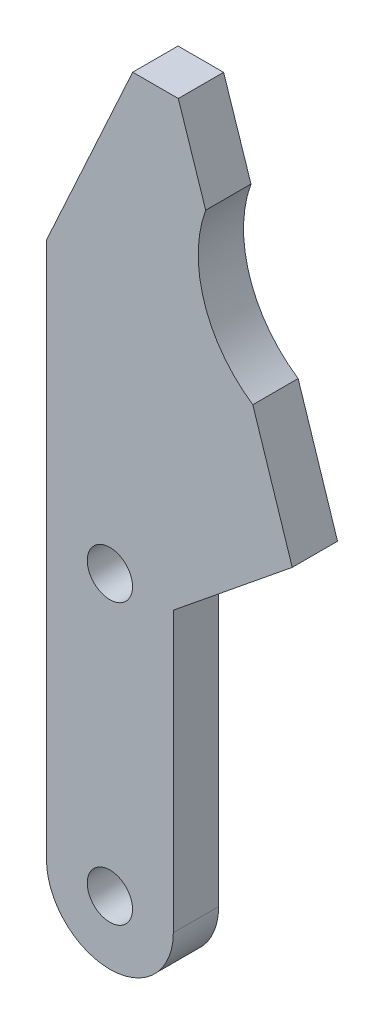
ISO-10303-21;
HEADER;
FILE_DESCRIPTION(('STEP AP214'),'2;1');
FILE_NAME('part.step','',(''),(''),'','','');
FILE_SCHEMA(('AUTOMOTIVE_DESIGN { 1 0 10303 214 1 1 1 1 }'));
ENDSEC;
DATA;
#1=APPLICATION_CONTEXT('core data for automotive mechanical design processes');
#2=APPLICATION_PROTOCOL_DEFINITION('international standard','automotive_design',2000,#1);
#3=PRODUCT_CONTEXT('',#1,'mechanical');
#4=PRODUCT('Part','Part','',(#3));
#5=PRODUCT_RELATED_PRODUCT_CATEGORY('part','',(#4));
#6=PRODUCT_DEFINITION_FORMATION('','',#4);
#7=PRODUCT_DEFINITION_CONTEXT('part definition',#1,'design');
#8=PRODUCT_DEFINITION('design','',#6,#7);
#9=PRODUCT_DEFINITION_SHAPE('','',#8);
#10=(LENGTH_UNIT() NAMED_UNIT(*) SI_UNIT(.MILLI.,.METRE.));
#11=(NAMED_UNIT(*) PLANE_ANGLE_UNIT() SI_UNIT($,.RADIAN.));
#12=(NAMED_UNIT(*) SI_UNIT($,.STERADIAN.) SOLID_ANGLE_UNIT());
#13=UNCERTAINTY_MEASURE_WITH_UNIT(LENGTH_MEASURE(1.E-05),#10,'distance_accuracy_value','');
#14=(GEOMETRIC_REPRESENTATION_CONTEXT(3) GLOBAL_UNCERTAINTY_ASSIGNED_CONTEXT((#13)) GLOBAL_UNIT_ASSIGNED_CONTEXT((#10,
#11,#12)) REPRESENTATION_CONTEXT('',''));
#15=CARTESIAN_POINT('',(0.,0.,0.));
#16=DIRECTION('',(0.,0.,1.));
#17=DIRECTION('',(1.,0.,0.));
#18=AXIS2_PLACEMENT_3D('',#15,#16,#17);
#19=CARTESIAN_POINT('',(4.16338722026961,4.86819386238371,1.27));
#20=DIRECTION('',(0.,0.,1.));
#21=DIRECTION('',(1.,0.,0.));
#22=AXIS2_PLACEMENT_3D('',#19,#20,#21);
#23=PLANE('',#22);
#24=CARTESIAN_POINT('',(-1.778,-11.938,1.27));
#25=DIRECTION('',(0.,0.,1.));
#26=DIRECTION('',(1.,0.,0.));
#27=AXIS2_PLACEMENT_3D('',#24,#25,#26);
#28=CIRCLE('',#27,0.635);
#29=CARTESIAN_POINT('',(-1.143,-11.938,1.27));
#30=VERTEX_POINT('',#29);
#31=EDGE_CURVE('E146',#30,#30,#28,.T.);
#32=ORIENTED_EDGE('',*,*,#31,.F.);
#33=EDGE_LOOP('',(#32));
#34=FACE_BOUND('',#33,.T.);
#35=CARTESIAN_POINT('',(4.16338722026961,4.86819386238371,1.27));
#36=DIRECTION('',(0.,0.,-1.));
#37=DIRECTION('',(1.,0.,0.));
#38=AXIS2_PLACEMENT_3D('',#35,#36,#37);
#39=CIRCLE('',#38,3.46596264179077);
#40=CARTESIAN_POINT('',(2.22771200534664,1.99311847265534,1.27));
#41=VERTEX_POINT('',#40);
#42=CARTESIAN_POINT('',(0.906732126933909,6.05440406185947,1.27));
#43=VERTEX_POINT('',#42);
#44=EDGE_CURVE('E159',#41,#43,#39,.T.);
#45=ORIENTED_EDGE('',*,*,#44,.T.);
#46=DIRECTION('',(-0.313175536784699,0.949695258048399,0.));
#47=VECTOR('',#46,1.);
#48=CARTESIAN_POINT('',(0.906732126933909,6.05440406185947,1.27));
#49=LINE('',#48,#47);
#50=CARTESIAN_POINT('',(0.139174216996555,8.382,1.27));
#51=VERTEX_POINT('',#50);
#52=EDGE_CURVE('E102',#43,#51,#49,.T.);
#53=ORIENTED_EDGE('',*,*,#52,.T.);
#54=DIRECTION('',(-1.,0.,0.));
#55=VECTOR('',#54,1.);
#56=CARTESIAN_POINT('',(0.139174216996555,8.382,1.27));
#57=LINE('',#56,#55);
#58=CARTESIAN_POINT('',(-1.13865738551377,8.382,1.27));
#59=VERTEX_POINT('',#58);
#60=EDGE_CURVE('E177',#51,#59,#57,.T.);
#61=ORIENTED_EDGE('',*,*,#60,.T.);
#62=DIRECTION('',(-0.416099978071877,-0.909318870500653,0.));
#63=VECTOR('',#62,1.);
#64=CARTESIAN_POINT('',(-3.556,3.09929062326937,1.27));
#65=LINE('',#64,#63);
#66=CARTESIAN_POINT('',(-3.556,3.09929062326937,1.27));
#67=VERTEX_POINT('',#66);
#68=EDGE_CURVE('E194',#59,#67,#65,.T.);
#69=ORIENTED_EDGE('',*,*,#68,.T.);
#70=DIRECTION('',(0.,-1.,0.));
#71=VECTOR('',#70,1.);
#72=CARTESIAN_POINT('',(-3.556,-11.938,1.27));
#73=LINE('',#72,#71);
#74=CARTESIAN_POINT('',(-3.556,-11.938,1.27));
#75=VERTEX_POINT('',#74);
#76=EDGE_CURVE('E193',#67,#75,#73,.T.);
#77=ORIENTED_EDGE('',*,*,#76,.T.);
#78=CARTESIAN_POINT('',(-1.778,-11.938,1.27));
#79=DIRECTION('',(0.,0.,1.));
#80=DIRECTION('',(1.,0.,0.));
#81=AXIS2_PLACEMENT_3D('',#78,#79,#80);
#82=CIRCLE('',#81,1.778);
#83=CARTESIAN_POINT('',(0.,-11.938,1.27));
#84=VERTEX_POINT('',#83);
#85=EDGE_CURVE('E124',#75,#84,#82,.T.);
#86=ORIENTED_EDGE('',*,*,#85,.T.);
#87=DIRECTION('',(0.,1.,0.));
#88=VECTOR('',#87,1.);
#89=CARTESIAN_POINT('',(0.,-11.938,1.27));
#90=LINE('',#89,#88);
#91=CARTESIAN_POINT('',(0.,-4.10790092400963,1.27));
#92=VERTEX_POINT('',#91);
#93=EDGE_CURVE('E118',#84,#92,#90,.T.);
#94=ORIENTED_EDGE('',*,*,#93,.T.);
#95=DIRECTION('',(0.776539289188919,0.630068831435082,0.));
#96=VECTOR('',#95,1.);
#97=CARTESIAN_POINT('',(0.,-4.10790092400963,1.27));
#98=LINE('',#97,#96);
#99=CARTESIAN_POINT('',(3.3326233424179,-1.40387535285829,1.27));
#100=VERTEX_POINT('',#99);
#101=EDGE_CURVE('E122',#92,#100,#98,.T.);
#102=ORIENTED_EDGE('',*,*,#101,.T.);
#103=DIRECTION('',(-0.309310990458131,0.950960940933859,0.));
#104=VECTOR('',#103,1.);
#105=CARTESIAN_POINT('',(3.3326233424179,-1.40387535285829,1.27));
#106=LINE('',#105,#104);
#107=EDGE_CURVE('E56',#100,#41,#106,.T.);
#108=ORIENTED_EDGE('',*,*,#107,.T.);
#109=EDGE_LOOP('',(#45,#53,#61,#69,#77,#86,#94,#102,#108));
#110=FACE_BOUND('',#109,.T.);
#111=CARTESIAN_POINT('',(-1.778,-4.10790092400963,1.27));
#112=DIRECTION('',(0.,0.,1.));
#113=DIRECTION('',(1.,0.,0.));
#114=AXIS2_PLACEMENT_3D('',#111,#112,#113);
#115=CIRCLE('',#114,0.635000000000001);
#116=CARTESIAN_POINT('',(-1.143,-4.10790092400963,1.27));
#117=VERTEX_POINT('',#116);
#118=EDGE_CURVE('E204',#117,#117,#115,.T.);
#119=ORIENTED_EDGE('',*,*,#118,.F.);
#120=EDGE_LOOP('',(#119));
#121=FACE_BOUND('',#120,.T.);
#122=ADVANCED_FACE('F39',(#34,#110,#121),#23,.T.);
#123=CARTESIAN_POINT('',(4.16338722026961,4.86819386238371,0.));
#124=DIRECTION('',(0.,0.,1.));
#125=DIRECTION('',(1.,0.,0.));
#126=AXIS2_PLACEMENT_3D('',#123,#124,#125);
#127=PLANE('',#126);
#128=CARTESIAN_POINT('',(4.16338722026961,4.86819386238371,0.));
#129=DIRECTION('',(0.,0.,-1.));
#130=DIRECTION('',(1.,0.,0.));
#131=AXIS2_PLACEMENT_3D('',#128,#129,#130);
#132=CIRCLE('',#131,3.46596264179077);
#133=CARTESIAN_POINT('',(2.22771200534664,1.99311847265534,0.));
#134=VERTEX_POINT('',#133);
#135=CARTESIAN_POINT('',(0.906732126933909,6.05440406185947,0.));
#136=VERTEX_POINT('',#135);
#137=EDGE_CURVE('E142',#134,#136,#132,.T.);
#138=ORIENTED_EDGE('',*,*,#137,.F.);
#139=DIRECTION('',(-0.309310990458131,0.950960940933859,0.));
#140=VECTOR('',#139,1.);
#141=CARTESIAN_POINT('',(3.3326233424179,-1.40387535285829,0.));
#142=LINE('',#141,#140);
#143=CARTESIAN_POINT('',(3.3326233424179,-1.40387535285829,0.));
#144=VERTEX_POINT('',#143);
#145=EDGE_CURVE('E94',#144,#134,#142,.T.);
#146=ORIENTED_EDGE('',*,*,#145,.F.);
#147=DIRECTION('',(0.776539289188919,0.630068831435082,0.));
#148=VECTOR('',#147,1.);
#149=CARTESIAN_POINT('',(0.,-4.10790092400963,0.));
#150=LINE('',#149,#148);
#151=CARTESIAN_POINT('',(0.,-4.10790092400963,0.));
#152=VERTEX_POINT('',#151);
#153=EDGE_CURVE('E88',#152,#144,#150,.T.);
#154=ORIENTED_EDGE('',*,*,#153,.F.);
#155=DIRECTION('',(0.,1.,0.));
#156=VECTOR('',#155,1.);
#157=CARTESIAN_POINT('',(0.,-11.938,0.));
#158=LINE('',#157,#156);
#159=CARTESIAN_POINT('',(0.,-11.938,0.));
#160=VERTEX_POINT('',#159);
#161=EDGE_CURVE('E132',#160,#152,#158,.T.);
#162=ORIENTED_EDGE('',*,*,#161,.F.);
#163=CARTESIAN_POINT('',(-1.778,-11.938,0.));
#164=DIRECTION('',(0.,0.,1.));
#165=DIRECTION('',(1.,0.,0.));
#166=AXIS2_PLACEMENT_3D('',#163,#164,#165);
#167=CIRCLE('',#166,1.778);
#168=CARTESIAN_POINT('',(-3.556,-11.938,0.));
#169=VERTEX_POINT('',#168);
#170=EDGE_CURVE('E154',#169,#160,#167,.T.);
#171=ORIENTED_EDGE('',*,*,#170,.F.);
#172=DIRECTION('',(0.,-1.,0.));
#173=VECTOR('',#172,1.);
#174=CARTESIAN_POINT('',(-3.556,-11.938,0.));
#175=LINE('',#174,#173);
#176=CARTESIAN_POINT('',(-3.556,3.09929062326937,0.));
#177=VERTEX_POINT('',#176);
#178=EDGE_CURVE('E152',#177,#169,#175,.T.);
#179=ORIENTED_EDGE('',*,*,#178,.F.);
#180=DIRECTION('',(-0.416099978071877,-0.909318870500653,0.));
#181=VECTOR('',#180,1.);
#182=CARTESIAN_POINT('',(-3.556,3.09929062326937,0.));
#183=LINE('',#182,#181);
#184=CARTESIAN_POINT('',(-1.13865738551377,8.382,0.));
#185=VERTEX_POINT('',#184);
#186=EDGE_CURVE('E150',#185,#177,#183,.T.);
#187=ORIENTED_EDGE('',*,*,#186,.F.);
#188=DIRECTION('',(-1.,0.,0.));
#189=VECTOR('',#188,1.);
#190=CARTESIAN_POINT('',(0.139174216996555,8.382,0.));
#191=LINE('',#190,#189);
#192=CARTESIAN_POINT('',(0.139174216996555,8.382,0.));
#193=VERTEX_POINT('',#192);
#194=EDGE_CURVE('E148',#193,#185,#191,.T.);
#195=ORIENTED_EDGE('',*,*,#194,.F.);
#196=DIRECTION('',(-0.313175536784699,0.949695258048399,0.));
#197=VECTOR('',#196,1.);
#198=CARTESIAN_POINT('',(0.906732126933909,6.05440406185947,0.));
#199=LINE('',#198,#197);
#200=EDGE_CURVE('E145',#136,#193,#199,.T.);
#201=ORIENTED_EDGE('',*,*,#200,.F.);
#202=EDGE_LOOP('',(#138,#146,#154,#162,#171,#179,#187,#195,#201));
#203=FACE_BOUND('',#202,.T.);
#204=CARTESIAN_POINT('',(-1.778,-11.938,0.));
#205=DIRECTION('',(0.,0.,1.));
#206=DIRECTION('',(1.,0.,0.));
#207=AXIS2_PLACEMENT_3D('',#204,#205,#206);
#208=CIRCLE('',#207,0.635);
#209=CARTESIAN_POINT('',(-1.143,-11.938,0.));
#210=VERTEX_POINT('',#209);
#211=EDGE_CURVE('E201',#210,#210,#208,.T.);
#212=ORIENTED_EDGE('',*,*,#211,.T.);
#213=EDGE_LOOP('',(#212));
#214=FACE_BOUND('',#213,.T.);
#215=CARTESIAN_POINT('',(-1.778,-4.10790092400963,0.));
#216=DIRECTION('',(0.,0.,1.));
#217=DIRECTION('',(1.,0.,0.));
#218=AXIS2_PLACEMENT_3D('',#215,#216,#217);
#219=CIRCLE('',#218,0.635000000000001);
#220=CARTESIAN_POINT('',(-1.143,-4.10790092400963,0.));
#221=VERTEX_POINT('',#220);
#222=EDGE_CURVE('E207',#221,#221,#219,.T.);
#223=ORIENTED_EDGE('',*,*,#222,.T.);
#224=EDGE_LOOP('',(#223));
#225=FACE_BOUND('',#224,.T.);
#226=ADVANCED_FACE('F181',(#203,#214,#225),#127,.F.);
#227=CARTESIAN_POINT('',(4.16338722026961,4.86819386238371,1.27));
#228=DIRECTION('',(0.,0.,-1.));
#229=DIRECTION('',(-1.,0.,0.));
#230=AXIS2_PLACEMENT_3D('',#227,#228,#229);
#231=CYLINDRICAL_SURFACE('',#230,3.46596264179077);
#232=ORIENTED_EDGE('',*,*,#137,.T.);
#233=DIRECTION('',(0.,0.,-1.));
#234=VECTOR('',#233,1.);
#235=CARTESIAN_POINT('',(0.906732126933909,6.05440406185947,1.27));
#236=LINE('',#235,#234);
#237=EDGE_CURVE('E11',#43,#136,#236,.T.);
#238=ORIENTED_EDGE('',*,*,#237,.F.);
#239=ORIENTED_EDGE('',*,*,#44,.F.);
#240=DIRECTION('',(0.,0.,-1.));
#241=VECTOR('',#240,1.);
#242=CARTESIAN_POINT('',(2.22771200534664,1.99311847265534,1.27));
#243=LINE('',#242,#241);
#244=EDGE_CURVE('E138',#41,#134,#243,.T.);
#245=ORIENTED_EDGE('',*,*,#244,.T.);
#246=EDGE_LOOP('',(#232,#238,#239,#245));
#247=FACE_BOUND('',#246,.T.);
#248=ADVANCED_FACE('F41',(#247),#231,.F.);
#249=CARTESIAN_POINT('',(0.906732126933909,6.05440406185947,1.27));
#250=DIRECTION('',(-0.949695258048399,-0.313175536784699,0.));
#251=DIRECTION('',(0.313175536784699,-0.949695258048399,0.));
#252=AXIS2_PLACEMENT_3D('',#249,#250,#251);
#253=PLANE('',#252);
#254=ORIENTED_EDGE('',*,*,#200,.T.);
#255=DIRECTION('',(0.,0.,-1.));
#256=VECTOR('',#255,1.);
#257=CARTESIAN_POINT('',(0.139174216996555,8.382,1.27));
#258=LINE('',#257,#256);
#259=EDGE_CURVE('E48',#51,#193,#258,.T.);
#260=ORIENTED_EDGE('',*,*,#259,.F.);
#261=ORIENTED_EDGE('',*,*,#52,.F.);
#262=ORIENTED_EDGE('',*,*,#237,.T.);
#263=EDGE_LOOP('',(#254,#260,#261,#262));
#264=FACE_BOUND('',#263,.T.);
#265=ADVANCED_FACE('F243',(#264),#253,.F.);
#266=CARTESIAN_POINT('',(0.139174216996555,8.382,1.27));
#267=DIRECTION('',(0.,-1.,0.));
#268=DIRECTION('',(1.,0.,0.));
#269=AXIS2_PLACEMENT_3D('',#266,#267,#268);
#270=PLANE('',#269);
#271=ORIENTED_EDGE('',*,*,#194,.T.);
#272=DIRECTION('',(0.,0.,-1.));
#273=VECTOR('',#272,1.);
#274=CARTESIAN_POINT('',(-1.13865738551377,8.382,1.27));
#275=LINE('',#274,#273);
#276=EDGE_CURVE('E169',#59,#185,#275,.T.);
#277=ORIENTED_EDGE('',*,*,#276,.F.);
#278=ORIENTED_EDGE('',*,*,#60,.F.);
#279=ORIENTED_EDGE('',*,*,#259,.T.);
#280=EDGE_LOOP('',(#271,#277,#278,#279));
#281=FACE_BOUND('',#280,.T.);
#282=ADVANCED_FACE('F175',(#281),#270,.F.);
#283=CARTESIAN_POINT('',(-3.556,3.09929062326937,1.27));
#284=DIRECTION('',(0.909318870500653,-0.416099978071877,0.));
#285=DIRECTION('',(0.416099978071877,0.909318870500653,0.));
#286=AXIS2_PLACEMENT_3D('',#283,#284,#285);
#287=PLANE('',#286);
#288=ORIENTED_EDGE('',*,*,#186,.T.);
#289=DIRECTION('',(0.,0.,-1.));
#290=VECTOR('',#289,1.);
#291=CARTESIAN_POINT('',(-3.556,3.09929062326937,1.27));
#292=LINE('',#291,#290);
#293=EDGE_CURVE('E166',#67,#177,#292,.T.);
#294=ORIENTED_EDGE('',*,*,#293,.F.);
#295=ORIENTED_EDGE('',*,*,#68,.F.);
#296=ORIENTED_EDGE('',*,*,#276,.T.);
#297=EDGE_LOOP('',(#288,#294,#295,#296));
#298=FACE_BOUND('',#297,.T.);
#299=ADVANCED_FACE('F187',(#298),#287,.F.);
#300=CARTESIAN_POINT('',(-3.556,-11.938,1.27));
#301=DIRECTION('',(1.,0.,0.));
#302=DIRECTION('',(0.,0.,-1.));
#303=AXIS2_PLACEMENT_3D('',#300,#301,#302);
#304=PLANE('',#303);
#305=ORIENTED_EDGE('',*,*,#178,.T.);
#306=DIRECTION('',(0.,0.,-1.));
#307=VECTOR('',#306,1.);
#308=CARTESIAN_POINT('',(-3.556,-11.938,1.27));
#309=LINE('',#308,#307);
#310=EDGE_CURVE('E163',#75,#169,#309,.T.);
#311=ORIENTED_EDGE('',*,*,#310,.F.);
#312=ORIENTED_EDGE('',*,*,#76,.F.);
#313=ORIENTED_EDGE('',*,*,#293,.T.);
#314=EDGE_LOOP('',(#305,#311,#312,#313));
#315=FACE_BOUND('',#314,.T.);
#316=ADVANCED_FACE('F191',(#315),#304,.F.);
#317=CARTESIAN_POINT('',(-1.778,-11.938,1.27));
#318=DIRECTION('',(0.,0.,-1.));
#319=DIRECTION('',(-1.,0.,0.));
#320=AXIS2_PLACEMENT_3D('',#317,#318,#319);
#321=CYLINDRICAL_SURFACE('',#320,1.778);
#322=ORIENTED_EDGE('',*,*,#170,.T.);
#323=DIRECTION('',(0.,0.,-1.));
#324=VECTOR('',#323,1.);
#325=CARTESIAN_POINT('',(0.,-11.938,1.27));
#326=LINE('',#325,#324);
#327=EDGE_CURVE('E133',#84,#160,#326,.T.);
#328=ORIENTED_EDGE('',*,*,#327,.F.);
#329=ORIENTED_EDGE('',*,*,#85,.F.);
#330=ORIENTED_EDGE('',*,*,#310,.T.);
#331=EDGE_LOOP('',(#322,#328,#329,#330));
#332=FACE_BOUND('',#331,.T.);
#333=ADVANCED_FACE('F234',(#332),#321,.T.);
#334=CARTESIAN_POINT('',(0.,-11.938,1.27));
#335=DIRECTION('',(-1.,0.,0.));
#336=DIRECTION('',(0.,0.,1.));
#337=AXIS2_PLACEMENT_3D('',#334,#335,#336);
#338=PLANE('',#337);
#339=ORIENTED_EDGE('',*,*,#161,.T.);
#340=DIRECTION('',(0.,0.,-1.));
#341=VECTOR('',#340,1.);
#342=CARTESIAN_POINT('',(0.,-4.10790092400963,1.27));
#343=LINE('',#342,#341);
#344=EDGE_CURVE('E129',#92,#152,#343,.T.);
#345=ORIENTED_EDGE('',*,*,#344,.F.);
#346=ORIENTED_EDGE('',*,*,#93,.F.);
#347=ORIENTED_EDGE('',*,*,#327,.T.);
#348=EDGE_LOOP('',(#339,#345,#346,#347));
#349=FACE_BOUND('',#348,.T.);
#350=ADVANCED_FACE('F130',(#349),#338,.F.);
#351=CARTESIAN_POINT('',(0.,-4.10790092400963,1.27));
#352=DIRECTION('',(-0.630068831435082,0.776539289188918,0.));
#353=DIRECTION('',(-0.776539289188919,-0.630068831435082,0.));
#354=AXIS2_PLACEMENT_3D('',#351,#352,#353);
#355=PLANE('',#354);
#356=ORIENTED_EDGE('',*,*,#153,.T.);
#357=DIRECTION('',(0.,0.,-1.));
#358=VECTOR('',#357,1.);
#359=CARTESIAN_POINT('',(3.3326233424179,-1.40387535285829,1.27));
#360=LINE('',#359,#358);
#361=EDGE_CURVE('E134',#100,#144,#360,.T.);
#362=ORIENTED_EDGE('',*,*,#361,.F.);
#363=ORIENTED_EDGE('',*,*,#101,.F.);
#364=ORIENTED_EDGE('',*,*,#344,.T.);
#365=EDGE_LOOP('',(#356,#362,#363,#364));
#366=FACE_BOUND('',#365,.T.);
#367=ADVANCED_FACE('F136',(#366),#355,.F.);
#368=CARTESIAN_POINT('',(3.3326233424179,-1.40387535285829,1.27));
#369=DIRECTION('',(-0.950960940933859,-0.309310990458131,0.));
#370=DIRECTION('',(0.309310990458131,-0.950960940933859,0.));
#371=AXIS2_PLACEMENT_3D('',#368,#369,#370);
#372=PLANE('',#371);
#373=ORIENTED_EDGE('',*,*,#145,.T.);
#374=ORIENTED_EDGE('',*,*,#244,.F.);
#375=ORIENTED_EDGE('',*,*,#107,.F.);
#376=ORIENTED_EDGE('',*,*,#361,.T.);
#377=EDGE_LOOP('',(#373,#374,#375,#376));
#378=FACE_BOUND('',#377,.T.);
#379=ADVANCED_FACE('F227',(#378),#372,.F.);
#380=CARTESIAN_POINT('',(-1.778,-11.938,1.27));
#381=DIRECTION('',(0.,0.,-1.));
#382=DIRECTION('',(-1.,0.,0.));
#383=AXIS2_PLACEMENT_3D('',#380,#381,#382);
#384=CYLINDRICAL_SURFACE('',#383,0.635);
#385=ORIENTED_EDGE('',*,*,#31,.T.);
#386=EDGE_LOOP('',(#385));
#387=FACE_BOUND('',#386,.T.);
#388=ORIENTED_EDGE('',*,*,#211,.F.);
#389=EDGE_LOOP('',(#388));
#390=FACE_BOUND('',#389,.T.);
#391=ADVANCED_FACE('F224',(#387,#390),#384,.F.);
#392=CARTESIAN_POINT('',(-1.778,-4.10790092400963,1.27));
#393=DIRECTION('',(0.,0.,-1.));
#394=DIRECTION('',(-1.,0.,0.));
#395=AXIS2_PLACEMENT_3D('',#392,#393,#394);
#396=CYLINDRICAL_SURFACE('',#395,0.635000000000001);
#397=ORIENTED_EDGE('',*,*,#118,.T.);
#398=EDGE_LOOP('',(#397));
#399=FACE_BOUND('',#398,.T.);
#400=ORIENTED_EDGE('',*,*,#222,.F.);
#401=EDGE_LOOP('',(#400));
#402=FACE_BOUND('',#401,.T.);
#403=ADVANCED_FACE('F213',(#399,#402),#396,.F.);
#404=CLOSED_SHELL('',(#122,#226,#248,#265,#282,#299,#316,#333,#350,#367,#379,#391,#403));
#405=MANIFOLD_SOLID_BREP('B2',#404);
#406=ADVANCED_BREP_SHAPE_REPRESENTATION('',(#18,#405),#14);
#407=SHAPE_DEFINITION_REPRESENTATION(#9,#406);
ENDSEC;
END-ISO-10303-21;
